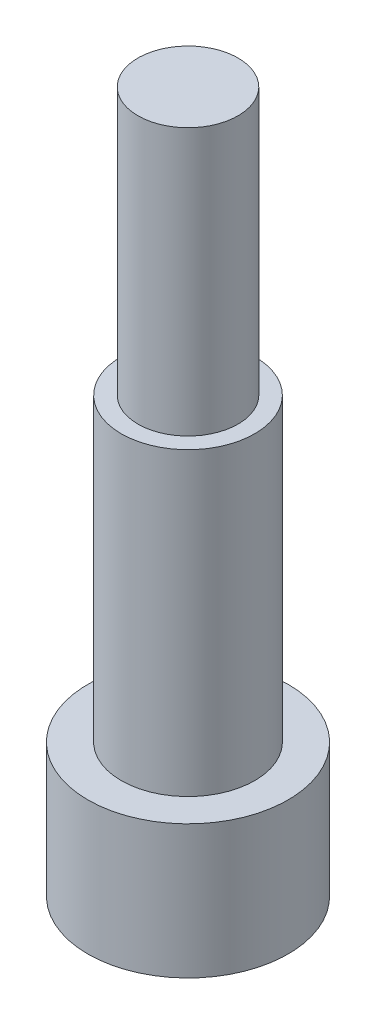
ISO-10303-21;
HEADER;
FILE_DESCRIPTION(('STEP AP214'),'2;1');
FILE_NAME('part.step','',(''),(''),'','','');
FILE_SCHEMA(('AUTOMOTIVE_DESIGN { 1 0 10303 214 1 1 1 1 }'));
ENDSEC;
DATA;
#1=APPLICATION_CONTEXT('core data for automotive mechanical design processes');
#2=APPLICATION_PROTOCOL_DEFINITION('international standard','automotive_design',2000,#1);
#3=PRODUCT_CONTEXT('',#1,'mechanical');
#4=PRODUCT('Part','Part','',(#3));
#5=PRODUCT_RELATED_PRODUCT_CATEGORY('part','',(#4));
#6=PRODUCT_DEFINITION_FORMATION('','',#4);
#7=PRODUCT_DEFINITION_CONTEXT('part definition',#1,'design');
#8=PRODUCT_DEFINITION('design','',#6,#7);
#9=PRODUCT_DEFINITION_SHAPE('','',#8);
#10=(LENGTH_UNIT() NAMED_UNIT(*) SI_UNIT(.MILLI.,.METRE.));
#11=(NAMED_UNIT(*) PLANE_ANGLE_UNIT() SI_UNIT($,.RADIAN.));
#12=(NAMED_UNIT(*) SI_UNIT($,.STERADIAN.) SOLID_ANGLE_UNIT());
#13=UNCERTAINTY_MEASURE_WITH_UNIT(LENGTH_MEASURE(1.E-05),#10,'distance_accuracy_value','');
#14=(GEOMETRIC_REPRESENTATION_CONTEXT(3) GLOBAL_UNCERTAINTY_ASSIGNED_CONTEXT((#13)) GLOBAL_UNIT_ASSIGNED_CONTEXT((#10,
#11,#12)) REPRESENTATION_CONTEXT('',''));
#15=CARTESIAN_POINT('',(0.,0.,0.));
#16=DIRECTION('',(0.,0.,1.));
#17=DIRECTION('',(1.,0.,0.));
#18=AXIS2_PLACEMENT_3D('',#15,#16,#17);
#19=CARTESIAN_POINT('',(0.,0.,0.));
#20=DIRECTION('',(0.,1.,0.));
#21=DIRECTION('',(0.,0.,1.));
#22=AXIS2_PLACEMENT_3D('',#19,#20,#21);
#23=PLANE('',#22);
#24=DIRECTION('',(0.866025403784438,0.,0.5));
#25=VECTOR('',#24,1.);
#26=CARTESIAN_POINT('',(0.,0.,-1.73205080756888));
#27=LINE('',#26,#25);
#28=CARTESIAN_POINT('',(0.,0.,-1.73205080756888));
#29=VERTEX_POINT('',#28);
#30=CARTESIAN_POINT('',(1.5,0.,-0.866025403784438));
#31=VERTEX_POINT('',#30);
#32=EDGE_CURVE('E121',#29,#31,#27,.T.);
#33=ORIENTED_EDGE('',*,*,#32,.F.);
#34=DIRECTION('',(0.866025403784439,0.,-0.5));
#35=VECTOR('',#34,1.);
#36=CARTESIAN_POINT('',(-1.5,0.,-0.866025403784439));
#37=LINE('',#36,#35);
#38=CARTESIAN_POINT('',(-1.5,0.,-0.866025403784439));
#39=VERTEX_POINT('',#38);
#40=EDGE_CURVE('E47',#39,#29,#37,.T.);
#41=ORIENTED_EDGE('',*,*,#40,.F.);
#42=DIRECTION('',(0.,0.,-1.));
#43=VECTOR('',#42,1.);
#44=CARTESIAN_POINT('',(-1.5,0.,0.86602540378444));
#45=LINE('',#44,#43);
#46=CARTESIAN_POINT('',(-1.5,0.,0.86602540378444));
#47=VERTEX_POINT('',#46);
#48=EDGE_CURVE('E130',#47,#39,#45,.T.);
#49=ORIENTED_EDGE('',*,*,#48,.F.);
#50=DIRECTION('',(-0.866025403784439,0.,-0.5));
#51=VECTOR('',#50,1.);
#52=CARTESIAN_POINT('',(0.,0.,1.73205080756888));
#53=LINE('',#52,#51);
#54=CARTESIAN_POINT('',(0.,0.,1.73205080756888));
#55=VERTEX_POINT('',#54);
#56=EDGE_CURVE('E128',#55,#47,#53,.T.);
#57=ORIENTED_EDGE('',*,*,#56,.F.);
#58=DIRECTION('',(-0.866025403784439,0.,0.5));
#59=VECTOR('',#58,1.);
#60=CARTESIAN_POINT('',(1.5,0.,0.86602540378444));
#61=LINE('',#60,#59);
#62=CARTESIAN_POINT('',(1.5,0.,0.86602540378444));
#63=VERTEX_POINT('',#62);
#64=EDGE_CURVE('E95',#63,#55,#61,.T.);
#65=ORIENTED_EDGE('',*,*,#64,.F.);
#66=DIRECTION('',(0.,0.,1.));
#67=VECTOR('',#66,1.);
#68=CARTESIAN_POINT('',(1.5,0.,-0.866025403784438));
#69=LINE('',#68,#67);
#70=EDGE_CURVE('E124',#31,#63,#69,.T.);
#71=ORIENTED_EDGE('',*,*,#70,.F.);
#72=EDGE_LOOP('',(#33,#41,#49,#57,#65,#71));
#73=FACE_BOUND('',#72,.T.);
#74=CARTESIAN_POINT('',(0.,0.,0.));
#75=DIRECTION('',(0.,1.,0.));
#76=DIRECTION('',(0.,0.,1.));
#77=AXIS2_PLACEMENT_3D('',#74,#75,#76);
#78=CIRCLE('',#77,3.);
#79=CARTESIAN_POINT('',(0.,0.,3.));
#80=VERTEX_POINT('',#79);
#81=EDGE_CURVE('E11',#80,#80,#78,.T.);
#82=ORIENTED_EDGE('',*,*,#81,.F.);
#83=EDGE_LOOP('',(#82));
#84=FACE_BOUND('',#83,.T.);
#85=ADVANCED_FACE('F33',(#73,#84),#23,.F.);
#86=CARTESIAN_POINT('',(0.,21.,0.));
#87=DIRECTION('',(0.,1.,0.));
#88=DIRECTION('',(0.,0.,1.));
#89=AXIS2_PLACEMENT_3D('',#86,#87,#88);
#90=CYLINDRICAL_SURFACE('',#89,3.);
#91=CARTESIAN_POINT('',(0.,4.,0.));
#92=DIRECTION('',(0.,1.,0.));
#93=DIRECTION('',(0.,0.,1.));
#94=AXIS2_PLACEMENT_3D('',#91,#92,#93);
#95=CIRCLE('',#94,3.);
#96=CARTESIAN_POINT('',(0.,4.,3.));
#97=VERTEX_POINT('',#96);
#98=EDGE_CURVE('E40',#97,#97,#95,.T.);
#99=ORIENTED_EDGE('',*,*,#98,.F.);
#100=EDGE_LOOP('',(#99));
#101=FACE_BOUND('',#100,.T.);
#102=ORIENTED_EDGE('',*,*,#81,.T.);
#103=EDGE_LOOP('',(#102));
#104=FACE_BOUND('',#103,.T.);
#105=ADVANCED_FACE('F155',(#101,#104),#90,.T.);
#106=CARTESIAN_POINT('',(3.,4.,0.));
#107=DIRECTION('',(0.,-1.,0.));
#108=DIRECTION('',(0.,0.,-1.));
#109=AXIS2_PLACEMENT_3D('',#106,#107,#108);
#110=PLANE('',#109);
#111=CARTESIAN_POINT('',(0.,4.,0.));
#112=DIRECTION('',(0.,1.,0.));
#113=DIRECTION('',(0.,0.,1.));
#114=AXIS2_PLACEMENT_3D('',#111,#112,#113);
#115=CIRCLE('',#114,2.);
#116=CARTESIAN_POINT('',(0.,4.,2.));
#117=VERTEX_POINT('',#116);
#118=EDGE_CURVE('E148',#117,#117,#115,.T.);
#119=ORIENTED_EDGE('',*,*,#118,.F.);
#120=EDGE_LOOP('',(#119));
#121=FACE_BOUND('',#120,.T.);
#122=ORIENTED_EDGE('',*,*,#98,.T.);
#123=EDGE_LOOP('',(#122));
#124=FACE_BOUND('',#123,.T.);
#125=ADVANCED_FACE('F153',(#121,#124),#110,.F.);
#126=CARTESIAN_POINT('',(0.,21.,0.));
#127=DIRECTION('',(0.,1.,0.));
#128=DIRECTION('',(0.,0.,1.));
#129=AXIS2_PLACEMENT_3D('',#126,#127,#128);
#130=CYLINDRICAL_SURFACE('',#129,2.00000000000001);
#131=CARTESIAN_POINT('',(0.,13.,0.));
#132=DIRECTION('',(0.,1.,0.));
#133=DIRECTION('',(0.,0.,1.));
#134=AXIS2_PLACEMENT_3D('',#131,#132,#133);
#135=CIRCLE('',#134,2.00000000000001);
#136=CARTESIAN_POINT('',(0.,13.,2.00000000000001));
#137=VERTEX_POINT('',#136);
#138=EDGE_CURVE('E145',#137,#137,#135,.T.);
#139=ORIENTED_EDGE('',*,*,#138,.F.);
#140=EDGE_LOOP('',(#139));
#141=FACE_BOUND('',#140,.T.);
#142=ORIENTED_EDGE('',*,*,#118,.T.);
#143=EDGE_LOOP('',(#142));
#144=FACE_BOUND('',#143,.T.);
#145=ADVANCED_FACE('F192',(#141,#144),#130,.T.);
#146=CARTESIAN_POINT('',(2.00000000000001,13.,0.));
#147=DIRECTION('',(0.,-1.,0.));
#148=DIRECTION('',(0.,0.,-1.));
#149=AXIS2_PLACEMENT_3D('',#146,#147,#148);
#150=PLANE('',#149);
#151=CARTESIAN_POINT('',(0.,13.,0.));
#152=DIRECTION('',(0.,1.,0.));
#153=DIRECTION('',(0.,0.,1.));
#154=AXIS2_PLACEMENT_3D('',#151,#152,#153);
#155=CIRCLE('',#154,1.5);
#156=CARTESIAN_POINT('',(0.,13.,1.5));
#157=VERTEX_POINT('',#156);
#158=EDGE_CURVE('E142',#157,#157,#155,.T.);
#159=ORIENTED_EDGE('',*,*,#158,.F.);
#160=EDGE_LOOP('',(#159));
#161=FACE_BOUND('',#160,.T.);
#162=ORIENTED_EDGE('',*,*,#138,.T.);
#163=EDGE_LOOP('',(#162));
#164=FACE_BOUND('',#163,.T.);
#165=ADVANCED_FACE('F188',(#161,#164),#150,.F.);
#166=CARTESIAN_POINT('',(0.,21.,0.));
#167=DIRECTION('',(0.,1.,0.));
#168=DIRECTION('',(0.,0.,1.));
#169=AXIS2_PLACEMENT_3D('',#166,#167,#168);
#170=CYLINDRICAL_SURFACE('',#169,1.5);
#171=CARTESIAN_POINT('',(0.,21.,0.));
#172=DIRECTION('',(0.,1.,0.));
#173=DIRECTION('',(0.,0.,1.));
#174=AXIS2_PLACEMENT_3D('',#171,#172,#173);
#175=CIRCLE('',#174,1.5);
#176=CARTESIAN_POINT('',(0.,21.,1.5));
#177=VERTEX_POINT('',#176);
#178=EDGE_CURVE('E134',#177,#177,#175,.T.);
#179=ORIENTED_EDGE('',*,*,#178,.F.);
#180=EDGE_LOOP('',(#179));
#181=FACE_BOUND('',#180,.T.);
#182=ORIENTED_EDGE('',*,*,#158,.T.);
#183=EDGE_LOOP('',(#182));
#184=FACE_BOUND('',#183,.T.);
#185=ADVANCED_FACE('F180',(#181,#184),#170,.T.);
#186=CARTESIAN_POINT('',(1.5,21.,0.));
#187=DIRECTION('',(0.,-1.,0.));
#188=DIRECTION('',(0.,0.,-1.));
#189=AXIS2_PLACEMENT_3D('',#186,#187,#188);
#190=PLANE('',#189);
#191=ORIENTED_EDGE('',*,*,#178,.T.);
#192=EDGE_LOOP('',(#191));
#193=FACE_BOUND('',#192,.T.);
#194=ADVANCED_FACE('F173',(#193),#190,.F.);
#195=CARTESIAN_POINT('',(-1.5,2.,-0.866025403784439));
#196=DIRECTION('',(-0.5,0.,-0.866025403784439));
#197=DIRECTION('',(-0.866025403784439,0.,0.5));
#198=AXIS2_PLACEMENT_3D('',#195,#196,#197);
#199=PLANE('',#198);
#200=ORIENTED_EDGE('',*,*,#40,.T.);
#201=DIRECTION('',(0.,-1.,0.));
#202=VECTOR('',#201,1.);
#203=CARTESIAN_POINT('',(0.,2.,-1.73205080756888));
#204=LINE('',#203,#202);
#205=CARTESIAN_POINT('',(0.,2.,-1.73205080756888));
#206=VERTEX_POINT('',#205);
#207=EDGE_CURVE('E77',#206,#29,#204,.T.);
#208=ORIENTED_EDGE('',*,*,#207,.F.);
#209=DIRECTION('',(0.866025403784439,0.,-0.5));
#210=VECTOR('',#209,1.);
#211=CARTESIAN_POINT('',(-1.5,2.,-0.866025403784439));
#212=LINE('',#211,#210);
#213=CARTESIAN_POINT('',(-1.5,2.,-0.866025403784439));
#214=VERTEX_POINT('',#213);
#215=EDGE_CURVE('E132',#214,#206,#212,.T.);
#216=ORIENTED_EDGE('',*,*,#215,.F.);
#217=DIRECTION('',(0.,-1.,0.));
#218=VECTOR('',#217,1.);
#219=CARTESIAN_POINT('',(-1.5,2.,-0.866025403784439));
#220=LINE('',#219,#218);
#221=EDGE_CURVE('E55',#214,#39,#220,.T.);
#222=ORIENTED_EDGE('',*,*,#221,.T.);
#223=EDGE_LOOP('',(#200,#208,#216,#222));
#224=FACE_BOUND('',#223,.T.);
#225=ADVANCED_FACE('F170',(#224),#199,.F.);
#226=CARTESIAN_POINT('',(-1.5,2.,0.86602540378444));
#227=DIRECTION('',(-1.,0.,0.));
#228=DIRECTION('',(0.,0.,1.));
#229=AXIS2_PLACEMENT_3D('',#226,#227,#228);
#230=PLANE('',#229);
#231=ORIENTED_EDGE('',*,*,#48,.T.);
#232=ORIENTED_EDGE('',*,*,#221,.F.);
#233=DIRECTION('',(0.,0.,-1.));
#234=VECTOR('',#233,1.);
#235=CARTESIAN_POINT('',(-1.5,2.,0.86602540378444));
#236=LINE('',#235,#234);
#237=CARTESIAN_POINT('',(-1.5,2.,0.86602540378444));
#238=VERTEX_POINT('',#237);
#239=EDGE_CURVE('E107',#238,#214,#236,.T.);
#240=ORIENTED_EDGE('',*,*,#239,.F.);
#241=DIRECTION('',(0.,-1.,0.));
#242=VECTOR('',#241,1.);
#243=CARTESIAN_POINT('',(-1.5,2.,0.86602540378444));
#244=LINE('',#243,#242);
#245=EDGE_CURVE('E99',#238,#47,#244,.T.);
#246=ORIENTED_EDGE('',*,*,#245,.T.);
#247=EDGE_LOOP('',(#231,#232,#240,#246));
#248=FACE_BOUND('',#247,.T.);
#249=ADVANCED_FACE('F172',(#248),#230,.F.);
#250=CARTESIAN_POINT('',(0.,2.,1.73205080756888));
#251=DIRECTION('',(-0.5,0.,0.866025403784439));
#252=DIRECTION('',(0.866025403784439,0.,0.5));
#253=AXIS2_PLACEMENT_3D('',#250,#251,#252);
#254=PLANE('',#253);
#255=ORIENTED_EDGE('',*,*,#56,.T.);
#256=ORIENTED_EDGE('',*,*,#245,.F.);
#257=DIRECTION('',(-0.866025403784439,0.,-0.5));
#258=VECTOR('',#257,1.);
#259=CARTESIAN_POINT('',(0.,2.,1.73205080756888));
#260=LINE('',#259,#258);
#261=CARTESIAN_POINT('',(0.,2.,1.73205080756888));
#262=VERTEX_POINT('',#261);
#263=EDGE_CURVE('E103',#262,#238,#260,.T.);
#264=ORIENTED_EDGE('',*,*,#263,.F.);
#265=DIRECTION('',(0.,-1.,0.));
#266=VECTOR('',#265,1.);
#267=CARTESIAN_POINT('',(0.,2.,1.73205080756888));
#268=LINE('',#267,#266);
#269=EDGE_CURVE('E88',#262,#55,#268,.T.);
#270=ORIENTED_EDGE('',*,*,#269,.T.);
#271=EDGE_LOOP('',(#255,#256,#264,#270));
#272=FACE_BOUND('',#271,.T.);
#273=ADVANCED_FACE('F104',(#272),#254,.F.);
#274=CARTESIAN_POINT('',(1.5,2.,0.86602540378444));
#275=DIRECTION('',(0.5,0.,0.866025403784439));
#276=DIRECTION('',(0.866025403784439,0.,-0.5));
#277=AXIS2_PLACEMENT_3D('',#274,#275,#276);
#278=PLANE('',#277);
#279=ORIENTED_EDGE('',*,*,#64,.T.);
#280=ORIENTED_EDGE('',*,*,#269,.F.);
#281=DIRECTION('',(-0.866025403784439,0.,0.5));
#282=VECTOR('',#281,1.);
#283=CARTESIAN_POINT('',(1.5,2.,0.86602540378444));
#284=LINE('',#283,#282);
#285=CARTESIAN_POINT('',(1.5,2.,0.86602540378444));
#286=VERTEX_POINT('',#285);
#287=EDGE_CURVE('E92',#286,#262,#284,.T.);
#288=ORIENTED_EDGE('',*,*,#287,.F.);
#289=DIRECTION('',(0.,-1.,0.));
#290=VECTOR('',#289,1.);
#291=CARTESIAN_POINT('',(1.5,2.,0.86602540378444));
#292=LINE('',#291,#290);
#293=EDGE_CURVE('E100',#286,#63,#292,.T.);
#294=ORIENTED_EDGE('',*,*,#293,.T.);
#295=EDGE_LOOP('',(#279,#280,#288,#294));
#296=FACE_BOUND('',#295,.T.);
#297=ADVANCED_FACE('F90',(#296),#278,.F.);
#298=CARTESIAN_POINT('',(1.5,2.,-0.866025403784438));
#299=DIRECTION('',(1.,0.,0.));
#300=DIRECTION('',(0.,0.,-1.));
#301=AXIS2_PLACEMENT_3D('',#298,#299,#300);
#302=PLANE('',#301);
#303=ORIENTED_EDGE('',*,*,#70,.T.);
#304=ORIENTED_EDGE('',*,*,#293,.F.);
#305=DIRECTION('',(0.,0.,1.));
#306=VECTOR('',#305,1.);
#307=CARTESIAN_POINT('',(1.5,2.,-0.866025403784438));
#308=LINE('',#307,#306);
#309=CARTESIAN_POINT('',(1.5,2.,-0.866025403784438));
#310=VERTEX_POINT('',#309);
#311=EDGE_CURVE('E113',#310,#286,#308,.T.);
#312=ORIENTED_EDGE('',*,*,#311,.F.);
#313=DIRECTION('',(0.,-1.,0.));
#314=VECTOR('',#313,1.);
#315=CARTESIAN_POINT('',(1.5,2.,-0.866025403784438));
#316=LINE('',#315,#314);
#317=EDGE_CURVE('E137',#310,#31,#316,.T.);
#318=ORIENTED_EDGE('',*,*,#317,.T.);
#319=EDGE_LOOP('',(#303,#304,#312,#318));
#320=FACE_BOUND('',#319,.T.);
#321=ADVANCED_FACE('F253',(#320),#302,.F.);
#322=CARTESIAN_POINT('',(0.,2.,-1.73205080756888));
#323=DIRECTION('',(0.5,0.,-0.866025403784438));
#324=DIRECTION('',(-0.866025403784438,0.,-0.5));
#325=AXIS2_PLACEMENT_3D('',#322,#323,#324);
#326=PLANE('',#325);
#327=ORIENTED_EDGE('',*,*,#32,.T.);
#328=ORIENTED_EDGE('',*,*,#317,.F.);
#329=DIRECTION('',(0.866025403784438,0.,0.5));
#330=VECTOR('',#329,1.);
#331=CARTESIAN_POINT('',(0.,2.,-1.73205080756888));
#332=LINE('',#331,#330);
#333=EDGE_CURVE('E115',#206,#310,#332,.T.);
#334=ORIENTED_EDGE('',*,*,#333,.F.);
#335=ORIENTED_EDGE('',*,*,#207,.T.);
#336=EDGE_LOOP('',(#327,#328,#334,#335));
#337=FACE_BOUND('',#336,.T.);
#338=ADVANCED_FACE('F168',(#337),#326,.F.);
#339=CARTESIAN_POINT('',(0.,2.,0.));
#340=DIRECTION('',(0.,-1.,0.));
#341=DIRECTION('',(0.,0.,-1.));
#342=AXIS2_PLACEMENT_3D('',#339,#340,#341);
#343=PLANE('',#342);
#344=ORIENTED_EDGE('',*,*,#215,.T.);
#345=ORIENTED_EDGE('',*,*,#333,.T.);
#346=ORIENTED_EDGE('',*,*,#311,.T.);
#347=ORIENTED_EDGE('',*,*,#287,.T.);
#348=ORIENTED_EDGE('',*,*,#263,.T.);
#349=ORIENTED_EDGE('',*,*,#239,.T.);
#350=EDGE_LOOP('',(#344,#345,#346,#347,#348,#349));
#351=FACE_BOUND('',#350,.T.);
#352=ADVANCED_FACE('F110',(#351),#343,.T.);
#353=CLOSED_SHELL('',(#85,#105,#125,#145,#165,#185,#194,#225,#249,#273,#297,#321,#338,#352));
#354=MANIFOLD_SOLID_BREP('B2',#353);
#355=ADVANCED_BREP_SHAPE_REPRESENTATION('',(#18,#354),#14);
#356=SHAPE_DEFINITION_REPRESENTATION(#9,#355);
ENDSEC;
END-ISO-10303-21;
